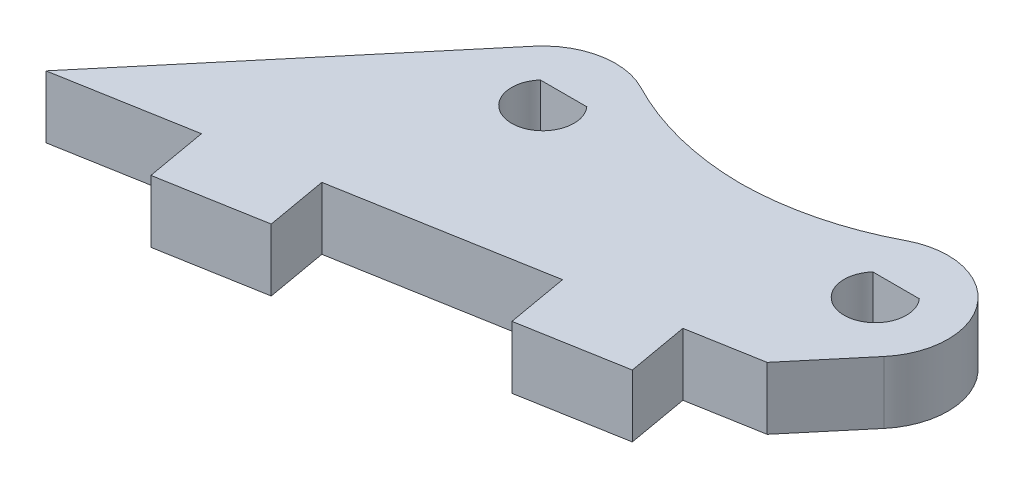
ISO-10303-21;
HEADER;
FILE_DESCRIPTION(('STEP AP214'),'2;1');
FILE_NAME('part.step','',(''),(''),'','','');
FILE_SCHEMA(('AUTOMOTIVE_DESIGN { 1 0 10303 214 1 1 1 1 }'));
ENDSEC;
DATA;
#1=APPLICATION_CONTEXT('core data for automotive mechanical design processes');
#2=APPLICATION_PROTOCOL_DEFINITION('international standard','automotive_design',2000,#1);
#3=PRODUCT_CONTEXT('',#1,'mechanical');
#4=PRODUCT('Part','Part','',(#3));
#5=PRODUCT_RELATED_PRODUCT_CATEGORY('part','',(#4));
#6=PRODUCT_DEFINITION_FORMATION('','',#4);
#7=PRODUCT_DEFINITION_CONTEXT('part definition',#1,'design');
#8=PRODUCT_DEFINITION('design','',#6,#7);
#9=PRODUCT_DEFINITION_SHAPE('','',#8);
#10=(LENGTH_UNIT() NAMED_UNIT(*) SI_UNIT(.MILLI.,.METRE.));
#11=(NAMED_UNIT(*) PLANE_ANGLE_UNIT() SI_UNIT($,.RADIAN.));
#12=(NAMED_UNIT(*) SI_UNIT($,.STERADIAN.) SOLID_ANGLE_UNIT());
#13=UNCERTAINTY_MEASURE_WITH_UNIT(LENGTH_MEASURE(1.E-05),#10,'distance_accuracy_value','');
#14=(GEOMETRIC_REPRESENTATION_CONTEXT(3) GLOBAL_UNCERTAINTY_ASSIGNED_CONTEXT((#13)) GLOBAL_UNIT_ASSIGNED_CONTEXT((#10,
#11,#12)) REPRESENTATION_CONTEXT('',''));
#15=CARTESIAN_POINT('',(0.,0.,0.));
#16=DIRECTION('',(0.,0.,1.));
#17=DIRECTION('',(1.,0.,0.));
#18=AXIS2_PLACEMENT_3D('',#15,#16,#17);
#19=CARTESIAN_POINT('',(0.912053363653995,3.,5.17251165981218));
#20=DIRECTION('',(0.173648177666927,0.,0.984807753012208));
#21=DIRECTION('',(0.984807753012209,0.,-0.173648177666927));
#22=AXIS2_PLACEMENT_3D('',#19,#20,#21);
#23=PLANE('',#22);
#24=DIRECTION('',(-0.984807753012209,0.,0.173648177666927));
#25=VECTOR('',#24,1.);
#26=CARTESIAN_POINT('',(0.912053363653995,0.,5.17251165981218));
#27=LINE('',#26,#25);
#28=CARTESIAN_POINT('',(-8.26086078843347,0.,6.78994391654768));
#29=VERTEX_POINT('',#28);
#30=CARTESIAN_POINT('',(-18.1089383185556,0.,8.52642569321695));
#31=VERTEX_POINT('',#30);
#32=EDGE_CURVE('E210',#29,#31,#27,.T.);
#33=ORIENTED_EDGE('',*,*,#32,.F.);
#34=DIRECTION('',(0.,-1.,0.));
#35=VECTOR('',#34,1.);
#36=CARTESIAN_POINT('',(-8.26086078843347,0.,6.78994391654768));
#37=LINE('',#36,#35);
#38=CARTESIAN_POINT('',(-8.26086078843347,3.,6.78994391654768));
#39=VERTEX_POINT('',#38);
#40=EDGE_CURVE('E291',#39,#29,#37,.T.);
#41=ORIENTED_EDGE('',*,*,#40,.F.);
#42=DIRECTION('',(-0.984807753012209,0.,0.173648177666927));
#43=VECTOR('',#42,1.);
#44=CARTESIAN_POINT('',(0.912053363653995,3.,5.17251165981218));
#45=LINE('',#44,#43);
#46=CARTESIAN_POINT('',(-18.1089383185556,3.,8.52642569321695));
#47=VERTEX_POINT('',#46);
#48=EDGE_CURVE('E261',#39,#47,#45,.T.);
#49=ORIENTED_EDGE('',*,*,#48,.T.);
#50=DIRECTION('',(0.,1.,0.));
#51=VECTOR('',#50,1.);
#52=CARTESIAN_POINT('',(-18.1089383185556,0.,8.52642569321696));
#53=LINE('',#52,#51);
#54=EDGE_CURVE('E288',#31,#47,#53,.T.);
#55=ORIENTED_EDGE('',*,*,#54,.F.);
#56=EDGE_LOOP('',(#33,#41,#49,#55));
#57=FACE_BOUND('',#56,.T.);
#58=ADVANCED_FACE('F41',(#57),#23,.T.);
#59=CARTESIAN_POINT('',(0.110005112170298,3.,5.3139344063788));
#60=VERTEX_POINT('',#59);
#61=CARTESIAN_POINT('',(-3.33682202337243,3.,5.92170302821305));
#62=VERTEX_POINT('',#61);
#63=EDGE_CURVE('E259',#60,#62,#45,.T.);
#64=ORIENTED_EDGE('',*,*,#63,.T.);
#65=DIRECTION('',(0.,1.,0.));
#66=VECTOR('',#65,1.);
#67=CARTESIAN_POINT('',(-3.33682202337243,0.,5.92170302821305));
#68=LINE('',#67,#66);
#69=CARTESIAN_POINT('',(-3.33682202337243,0.,5.92170302821305));
#70=VERTEX_POINT('',#69);
#71=EDGE_CURVE('E302',#70,#62,#68,.T.);
#72=ORIENTED_EDGE('',*,*,#71,.F.);
#73=CARTESIAN_POINT('',(0.110005112170298,0.,5.3139344063788));
#74=VERTEX_POINT('',#73);
#75=EDGE_CURVE('E206',#74,#70,#27,.T.);
#76=ORIENTED_EDGE('',*,*,#75,.F.);
#77=DIRECTION('',(0.,-1.,0.));
#78=VECTOR('',#77,1.);
#79=CARTESIAN_POINT('',(0.110005112170298,3.,5.3139344063788));
#80=LINE('',#79,#78);
#81=EDGE_CURVE('E191',#60,#74,#80,.T.);
#82=ORIENTED_EDGE('',*,*,#81,.F.);
#83=EDGE_LOOP('',(#64,#72,#76,#82));
#84=FACE_BOUND('',#83,.T.);
#85=ADVANCED_FACE('F340',(#84),#23,.T.);
#86=CARTESIAN_POINT('',(-16.,3.,0.));
#87=DIRECTION('',(0.,-1.,0.));
#88=DIRECTION('',(0.,0.,-1.));
#89=AXIS2_PLACEMENT_3D('',#86,#87,#88);
#90=CYLINDRICAL_SURFACE('',#89,3.5);
#91=CARTESIAN_POINT('',(-16.,3.,0.));
#92=DIRECTION('',(0.,1.,0.));
#93=DIRECTION('',(0.,0.,1.));
#94=AXIS2_PLACEMENT_3D('',#91,#92,#93);
#95=CIRCLE('',#94,3.5);
#96=CARTESIAN_POINT('',(-14.3751923190728,3.,-3.1));
#97=VERTEX_POINT('',#96);
#98=CARTESIAN_POINT('',(-18.6811555509164,3.,-2.24975663390287));
#99=VERTEX_POINT('',#98);
#100=EDGE_CURVE('E268',#97,#99,#95,.T.);
#101=ORIENTED_EDGE('',*,*,#100,.F.);
#102=DIRECTION('',(0.,-1.,0.));
#103=VECTOR('',#102,1.);
#104=CARTESIAN_POINT('',(-14.3751923190728,3.,-3.1));
#105=LINE('',#104,#103);
#106=CARTESIAN_POINT('',(-14.3751923190728,0.,-3.1));
#107=VERTEX_POINT('',#106);
#108=EDGE_CURVE('E228',#97,#107,#105,.T.);
#109=ORIENTED_EDGE('',*,*,#108,.T.);
#110=CARTESIAN_POINT('',(-16.,0.,0.));
#111=DIRECTION('',(0.,1.,0.));
#112=DIRECTION('',(0.,0.,1.));
#113=AXIS2_PLACEMENT_3D('',#110,#111,#112);
#114=CIRCLE('',#113,3.5);
#115=CARTESIAN_POINT('',(-18.6811555509164,0.,-2.24975663390287));
#116=VERTEX_POINT('',#115);
#117=EDGE_CURVE('E200',#107,#116,#114,.T.);
#118=ORIENTED_EDGE('',*,*,#117,.T.);
#119=DIRECTION('',(0.,-1.,0.));
#120=VECTOR('',#119,1.);
#121=CARTESIAN_POINT('',(-18.6811555509164,3.,-2.24975663390287));
#122=LINE('',#121,#120);
#123=EDGE_CURVE('E222',#99,#116,#122,.T.);
#124=ORIENTED_EDGE('',*,*,#123,.F.);
#125=EDGE_LOOP('',(#101,#109,#118,#124));
#126=FACE_BOUND('',#125,.T.);
#127=ADVANCED_FACE('F347',(#126),#90,.T.);
#128=CARTESIAN_POINT('',(-12.070340972252,3.,-10.1282186580005));
#129=DIRECTION('',(0.766044443118982,0.,0.642787609686535));
#130=DIRECTION('',(0.642787609686535,0.,-0.766044443118982));
#131=AXIS2_PLACEMENT_3D('',#128,#129,#130);
#132=PLANE('',#131);
#133=DIRECTION('',(-0.642787609686535,0.,0.766044443118982));
#134=VECTOR('',#133,1.);
#135=CARTESIAN_POINT('',(-12.070340972252,0.,-10.1282186580005));
#136=LINE('',#135,#134);
#137=CARTESIAN_POINT('',(-29.3929879341661,0.,10.516108092102));
#138=VERTEX_POINT('',#137);
#139=EDGE_CURVE('E202',#116,#138,#136,.T.);
#140=ORIENTED_EDGE('',*,*,#139,.T.);
#141=DIRECTION('',(0.,-1.,0.));
#142=VECTOR('',#141,1.);
#143=CARTESIAN_POINT('',(-29.3929879341661,3.,10.516108092102));
#144=LINE('',#143,#142);
#145=CARTESIAN_POINT('',(-29.3929879341661,3.,10.516108092102));
#146=VERTEX_POINT('',#145);
#147=EDGE_CURVE('E219',#146,#138,#144,.T.);
#148=ORIENTED_EDGE('',*,*,#147,.F.);
#149=DIRECTION('',(-0.642787609686535,0.,0.766044443118982));
#150=VECTOR('',#149,1.);
#151=CARTESIAN_POINT('',(-12.070340972252,3.,-10.1282186580005));
#152=LINE('',#151,#150);
#153=EDGE_CURVE('E265',#99,#146,#152,.T.);
#154=ORIENTED_EDGE('',*,*,#153,.F.);
#155=ORIENTED_EDGE('',*,*,#123,.T.);
#156=EDGE_LOOP('',(#140,#148,#154,#155));
#157=FACE_BOUND('',#156,.T.);
#158=ADVANCED_FACE('F354',(#157),#132,.F.);
#159=DIRECTION('',(0.,-1.,0.));
#160=VECTOR('',#159,1.);
#161=CARTESIAN_POINT('',(-23.0329770836166,0.,9.39466658155159));
#162=LINE('',#161,#160);
#163=CARTESIAN_POINT('',(-23.0329770836166,3.,9.39466658155159));
#164=VERTEX_POINT('',#163);
#165=CARTESIAN_POINT('',(-23.0329770836166,0.,9.39466658155159));
#166=VERTEX_POINT('',#165);
#167=EDGE_CURVE('E284',#164,#166,#162,.T.);
#168=ORIENTED_EDGE('',*,*,#167,.F.);
#169=EDGE_CURVE('E263',#164,#146,#45,.T.);
#170=ORIENTED_EDGE('',*,*,#169,.T.);
#171=ORIENTED_EDGE('',*,*,#147,.T.);
#172=EDGE_CURVE('E205',#166,#138,#27,.T.);
#173=ORIENTED_EDGE('',*,*,#172,.F.);
#174=EDGE_LOOP('',(#168,#170,#171,#173));
#175=FACE_BOUND('',#174,.T.);
#176=ADVANCED_FACE('F343',(#175),#23,.T.);
#177=CARTESIAN_POINT('',(2.68115555091644,3.,2.24975663390287));
#178=DIRECTION('',(0.766044443118982,0.,0.642787609686535));
#179=DIRECTION('',(0.642787609686535,0.,-0.766044443118982));
#180=AXIS2_PLACEMENT_3D('',#177,#178,#179);
#181=PLANE('',#180);
#182=DIRECTION('',(-0.642787609686535,0.,0.766044443118982));
#183=VECTOR('',#182,1.);
#184=CARTESIAN_POINT('',(2.68115555091644,0.,2.24975663390287));
#185=LINE('',#184,#183);
#186=CARTESIAN_POINT('',(2.68115555091644,0.,2.24975663390287));
#187=VERTEX_POINT('',#186);
#188=EDGE_CURVE('E209',#187,#74,#185,.T.);
#189=ORIENTED_EDGE('',*,*,#188,.F.);
#190=DIRECTION('',(0.,-1.,0.));
#191=VECTOR('',#190,1.);
#192=CARTESIAN_POINT('',(2.68115555091644,3.,2.24975663390287));
#193=LINE('',#192,#191);
#194=CARTESIAN_POINT('',(2.68115555091644,3.,2.24975663390287));
#195=VERTEX_POINT('',#194);
#196=EDGE_CURVE('E188',#195,#187,#193,.T.);
#197=ORIENTED_EDGE('',*,*,#196,.F.);
#198=DIRECTION('',(-0.642787609686535,0.,0.766044443118982));
#199=VECTOR('',#198,1.);
#200=CARTESIAN_POINT('',(2.68115555091644,3.,2.24975663390287));
#201=LINE('',#200,#199);
#202=EDGE_CURVE('E194',#195,#60,#201,.T.);
#203=ORIENTED_EDGE('',*,*,#202,.T.);
#204=ORIENTED_EDGE('',*,*,#81,.T.);
#205=EDGE_LOOP('',(#189,#197,#203,#204));
#206=FACE_BOUND('',#205,.T.);
#207=ADVANCED_FACE('F353',(#206),#181,.T.);
#208=CARTESIAN_POINT('',(0.,3.,0.));
#209=DIRECTION('',(0.,-1.,0.));
#210=DIRECTION('',(0.,0.,-1.));
#211=AXIS2_PLACEMENT_3D('',#208,#209,#210);
#212=CYLINDRICAL_SURFACE('',#211,3.5);
#213=CARTESIAN_POINT('',(0.,0.,0.));
#214=DIRECTION('',(0.,1.,0.));
#215=DIRECTION('',(0.,0.,1.));
#216=AXIS2_PLACEMENT_3D('',#213,#214,#215);
#217=CIRCLE('',#216,3.5);
#218=CARTESIAN_POINT('',(-1.62480768092719,0.,-3.1));
#219=VERTEX_POINT('',#218);
#220=EDGE_CURVE('E213',#187,#219,#217,.T.);
#221=ORIENTED_EDGE('',*,*,#220,.T.);
#222=DIRECTION('',(0.,-1.,0.));
#223=VECTOR('',#222,1.);
#224=CARTESIAN_POINT('',(-1.62480768092719,3.,-3.1));
#225=LINE('',#224,#223);
#226=CARTESIAN_POINT('',(-1.62480768092719,3.,-3.1));
#227=VERTEX_POINT('',#226);
#228=EDGE_CURVE('E225',#219,#227,#225,.F.);
#229=ORIENTED_EDGE('',*,*,#228,.T.);
#230=CARTESIAN_POINT('',(0.,3.,0.));
#231=DIRECTION('',(0.,1.,0.));
#232=DIRECTION('',(0.,0.,1.));
#233=AXIS2_PLACEMENT_3D('',#230,#231,#232);
#234=CIRCLE('',#233,3.5);
#235=EDGE_CURVE('E189',#195,#227,#234,.T.);
#236=ORIENTED_EDGE('',*,*,#235,.F.);
#237=ORIENTED_EDGE('',*,*,#196,.T.);
#238=EDGE_LOOP('',(#221,#229,#236,#237));
#239=FACE_BOUND('',#238,.T.);
#240=ADVANCED_FACE('F252',(#239),#212,.T.);
#241=CARTESIAN_POINT('',(-16.,3.,0.));
#242=DIRECTION('',(0.,-1.,0.));
#243=DIRECTION('',(0.,0.,-1.));
#244=AXIS2_PLACEMENT_3D('',#241,#242,#243);
#245=CYLINDRICAL_SURFACE('',#244,1.5);
#246=DIRECTION('',(0.,-1.,0.));
#247=VECTOR('',#246,1.);
#248=CARTESIAN_POINT('',(-17.1180339887499,5.29128784747792,-1.));
#249=LINE('',#248,#247);
#250=CARTESIAN_POINT('',(-17.1180339887499,3.,-1.));
#251=VERTEX_POINT('',#250);
#252=CARTESIAN_POINT('',(-17.1180339887499,0.,-1.));
#253=VERTEX_POINT('',#252);
#254=EDGE_CURVE('E323',#251,#253,#249,.T.);
#255=ORIENTED_EDGE('',*,*,#254,.F.);
#256=CARTESIAN_POINT('',(-16.,3.,0.));
#257=DIRECTION('',(0.,1.,0.));
#258=DIRECTION('',(0.,0.,1.));
#259=AXIS2_PLACEMENT_3D('',#256,#257,#258);
#260=CIRCLE('',#259,1.5);
#261=CARTESIAN_POINT('',(-14.8819660112501,3.,-1.));
#262=VERTEX_POINT('',#261);
#263=EDGE_CURVE('E216',#251,#262,#260,.T.);
#264=ORIENTED_EDGE('',*,*,#263,.T.);
#265=DIRECTION('',(0.,-1.,0.));
#266=VECTOR('',#265,1.);
#267=CARTESIAN_POINT('',(-14.8819660112501,5.29128784747792,-1.));
#268=LINE('',#267,#266);
#269=CARTESIAN_POINT('',(-14.8819660112501,0.,-1.));
#270=VERTEX_POINT('',#269);
#271=EDGE_CURVE('E320',#262,#270,#268,.T.);
#272=ORIENTED_EDGE('',*,*,#271,.T.);
#273=CARTESIAN_POINT('',(-16.,0.,0.));
#274=DIRECTION('',(0.,1.,0.));
#275=DIRECTION('',(0.,0.,1.));
#276=AXIS2_PLACEMENT_3D('',#273,#274,#275);
#277=CIRCLE('',#276,1.5);
#278=EDGE_CURVE('E198',#253,#270,#277,.T.);
#279=ORIENTED_EDGE('',*,*,#278,.F.);
#280=EDGE_LOOP('',(#255,#264,#272,#279));
#281=FACE_BOUND('',#280,.T.);
#282=ADVANCED_FACE('F418',(#281),#245,.F.);
#283=CARTESIAN_POINT('',(0.,3.,0.));
#284=DIRECTION('',(0.,-1.,0.));
#285=DIRECTION('',(0.,0.,-1.));
#286=AXIS2_PLACEMENT_3D('',#283,#284,#285);
#287=CYLINDRICAL_SURFACE('',#286,1.5);
#288=DIRECTION('',(0.,-1.,0.));
#289=VECTOR('',#288,1.);
#290=CARTESIAN_POINT('',(-1.11803398874989,5.29128784747792,-1.));
#291=LINE('',#290,#289);
#292=CARTESIAN_POINT('',(-1.11803398874989,3.,-1.));
#293=VERTEX_POINT('',#292);
#294=CARTESIAN_POINT('',(-1.11803398874989,0.,-1.));
#295=VERTEX_POINT('',#294);
#296=EDGE_CURVE('E174',#293,#295,#291,.T.);
#297=ORIENTED_EDGE('',*,*,#296,.F.);
#298=CARTESIAN_POINT('',(0.,3.,0.));
#299=DIRECTION('',(0.,1.,0.));
#300=DIRECTION('',(0.,0.,1.));
#301=AXIS2_PLACEMENT_3D('',#298,#299,#300);
#302=CIRCLE('',#301,1.5);
#303=CARTESIAN_POINT('',(1.11803398874989,3.,-1.));
#304=VERTEX_POINT('',#303);
#305=EDGE_CURVE('E184',#293,#304,#302,.T.);
#306=ORIENTED_EDGE('',*,*,#305,.T.);
#307=DIRECTION('',(0.,-1.,0.));
#308=VECTOR('',#307,1.);
#309=CARTESIAN_POINT('',(1.11803398874989,5.29128784747792,-1.));
#310=LINE('',#309,#308);
#311=CARTESIAN_POINT('',(1.11803398874989,0.,-1.));
#312=VERTEX_POINT('',#311);
#313=EDGE_CURVE('E177',#304,#312,#310,.T.);
#314=ORIENTED_EDGE('',*,*,#313,.T.);
#315=CARTESIAN_POINT('',(0.,0.,0.));
#316=DIRECTION('',(0.,1.,0.));
#317=DIRECTION('',(0.,0.,1.));
#318=AXIS2_PLACEMENT_3D('',#315,#316,#317);
#319=CIRCLE('',#318,1.5);
#320=EDGE_CURVE('E185',#295,#312,#319,.T.);
#321=ORIENTED_EDGE('',*,*,#320,.F.);
#322=EDGE_LOOP('',(#297,#306,#314,#321));
#323=FACE_BOUND('',#322,.T.);
#324=ADVANCED_FACE('F183',(#323),#287,.F.);
#325=CARTESIAN_POINT('',(0.,3.,0.));
#326=DIRECTION('',(0.,1.,0.));
#327=DIRECTION('',(0.,0.,1.));
#328=AXIS2_PLACEMENT_3D('',#325,#326,#327);
#329=PLANE('',#328);
#330=ORIENTED_EDGE('',*,*,#263,.F.);
#331=DIRECTION('',(-1.,0.,0.));
#332=VECTOR('',#331,1.);
#333=CARTESIAN_POINT('',(0.,3.,-0.999999999999997));
#334=LINE('',#333,#332);
#335=EDGE_CURVE('E325',#262,#251,#334,.T.);
#336=ORIENTED_EDGE('',*,*,#335,.F.);
#337=EDGE_LOOP('',(#330,#336));
#338=FACE_BOUND('',#337,.T.);
#339=CARTESIAN_POINT('',(-8.12403840463596,3.,-15.5));
#340=DIRECTION('',(0.,1.,0.));
#341=DIRECTION('',(0.,0.,1.));
#342=AXIS2_PLACEMENT_3D('',#339,#340,#341);
#343=CIRCLE('',#342,14.);
#344=CARTESIAN_POINT('',(-8.,3.,-1.50054949384886));
#345=VERTEX_POINT('',#344);
#346=EDGE_CURVE('E232',#227,#345,#343,.F.);
#347=ORIENTED_EDGE('',*,*,#346,.T.);
#348=CARTESIAN_POINT('',(-7.87596159536404,3.,-15.5));
#349=DIRECTION('',(0.,1.,0.));
#350=DIRECTION('',(0.,0.,1.));
#351=AXIS2_PLACEMENT_3D('',#348,#349,#350);
#352=CIRCLE('',#351,14.);
#353=EDGE_CURVE('E11',#345,#97,#352,.F.);
#354=ORIENTED_EDGE('',*,*,#353,.T.);
#355=ORIENTED_EDGE('',*,*,#100,.T.);
#356=ORIENTED_EDGE('',*,*,#153,.T.);
#357=ORIENTED_EDGE('',*,*,#169,.F.);
#358=DIRECTION('',(-0.173648177666927,0.,-0.984807753012208));
#359=VECTOR('',#358,1.);
#360=CARTESIAN_POINT('',(-22.5120325506158,3.,12.3490898405882));
#361=LINE('',#360,#359);
#362=CARTESIAN_POINT('',(-22.5120325506158,3.,12.3490898405882));
#363=VERTEX_POINT('',#362);
#364=EDGE_CURVE('E274',#363,#164,#361,.T.);
#365=ORIENTED_EDGE('',*,*,#364,.F.);
#366=DIRECTION('',(-0.984807753012208,0.,0.173648177666927));
#367=VECTOR('',#366,1.);
#368=CARTESIAN_POINT('',(-22.5120325506158,3.,12.3490898405882));
#369=LINE('',#368,#367);
#370=CARTESIAN_POINT('',(-17.5879937855548,3.,11.4808489522536));
#371=VERTEX_POINT('',#370);
#372=EDGE_CURVE('E295',#371,#363,#369,.T.);
#373=ORIENTED_EDGE('',*,*,#372,.F.);
#374=DIRECTION('',(-0.173648177666927,0.,-0.984807753012208));
#375=VECTOR('',#374,1.);
#376=CARTESIAN_POINT('',(-17.5879937855548,3.,11.4808489522536));
#377=LINE('',#376,#375);
#378=EDGE_CURVE('E247',#371,#47,#377,.T.);
#379=ORIENTED_EDGE('',*,*,#378,.T.);
#380=ORIENTED_EDGE('',*,*,#48,.F.);
#381=DIRECTION('',(-0.173648177666927,0.,-0.984807753012208));
#382=VECTOR('',#381,1.);
#383=CARTESIAN_POINT('',(-7.73991625543269,3.,9.74436717558431));
#384=LINE('',#383,#382);
#385=CARTESIAN_POINT('',(-7.73991625543269,3.,9.74436717558431));
#386=VERTEX_POINT('',#385);
#387=EDGE_CURVE('E309',#386,#39,#384,.T.);
#388=ORIENTED_EDGE('',*,*,#387,.F.);
#389=DIRECTION('',(-0.984807753012209,0.,0.173648177666927));
#390=VECTOR('',#389,1.);
#391=CARTESIAN_POINT('',(-2.81587749037165,3.,8.87612628724967));
#392=LINE('',#391,#390);
#393=CARTESIAN_POINT('',(-2.81587749037165,3.,8.87612628724967));
#394=VERTEX_POINT('',#393);
#395=EDGE_CURVE('E307',#394,#386,#392,.T.);
#396=ORIENTED_EDGE('',*,*,#395,.F.);
#397=DIRECTION('',(-0.173648177666927,0.,-0.984807753012208));
#398=VECTOR('',#397,1.);
#399=CARTESIAN_POINT('',(-2.81587749037165,3.,8.87612628724967));
#400=LINE('',#399,#398);
#401=EDGE_CURVE('E313',#394,#62,#400,.T.);
#402=ORIENTED_EDGE('',*,*,#401,.T.);
#403=ORIENTED_EDGE('',*,*,#63,.F.);
#404=ORIENTED_EDGE('',*,*,#202,.F.);
#405=ORIENTED_EDGE('',*,*,#235,.T.);
#406=EDGE_LOOP('',(#347,#354,#355,#356,#357,#365,#373,#379,#380,#388,#396,#402,#403,#404,#405));
#407=FACE_BOUND('',#406,.T.);
#408=ORIENTED_EDGE('',*,*,#305,.F.);
#409=DIRECTION('',(-1.,0.,0.));
#410=VECTOR('',#409,1.);
#411=CARTESIAN_POINT('',(0.,3.,-1.));
#412=LINE('',#411,#410);
#413=EDGE_CURVE('E171',#304,#293,#412,.T.);
#414=ORIENTED_EDGE('',*,*,#413,.F.);
#415=EDGE_LOOP('',(#408,#414));
#416=FACE_BOUND('',#415,.T.);
#417=ADVANCED_FACE('F187',(#338,#407,#416),#329,.T.);
#418=CARTESIAN_POINT('',(0.,0.,0.));
#419=DIRECTION('',(0.,1.,0.));
#420=DIRECTION('',(0.,0.,1.));
#421=AXIS2_PLACEMENT_3D('',#418,#419,#420);
#422=PLANE('',#421);
#423=ORIENTED_EDGE('',*,*,#278,.T.);
#424=DIRECTION('',(-1.,0.,0.));
#425=VECTOR('',#424,1.);
#426=CARTESIAN_POINT('',(0.,0.,-0.999999999999997));
#427=LINE('',#426,#425);
#428=EDGE_CURVE('E63',#270,#253,#427,.T.);
#429=ORIENTED_EDGE('',*,*,#428,.T.);
#430=EDGE_LOOP('',(#423,#429));
#431=FACE_BOUND('',#430,.T.);
#432=ORIENTED_EDGE('',*,*,#117,.F.);
#433=CARTESIAN_POINT('',(-7.87596159536404,0.,-15.5));
#434=DIRECTION('',(0.,1.,0.));
#435=DIRECTION('',(0.,0.,1.));
#436=AXIS2_PLACEMENT_3D('',#433,#434,#435);
#437=CIRCLE('',#436,14.);
#438=CARTESIAN_POINT('',(-8.,0.,-1.50054949384886));
#439=VERTEX_POINT('',#438);
#440=EDGE_CURVE('E50',#107,#439,#437,.T.);
#441=ORIENTED_EDGE('',*,*,#440,.T.);
#442=CARTESIAN_POINT('',(-8.12403840463596,0.,-15.5));
#443=DIRECTION('',(0.,1.,0.));
#444=DIRECTION('',(0.,0.,1.));
#445=AXIS2_PLACEMENT_3D('',#442,#443,#444);
#446=CIRCLE('',#445,14.);
#447=EDGE_CURVE('E230',#439,#219,#446,.T.);
#448=ORIENTED_EDGE('',*,*,#447,.T.);
#449=ORIENTED_EDGE('',*,*,#220,.F.);
#450=ORIENTED_EDGE('',*,*,#188,.T.);
#451=ORIENTED_EDGE('',*,*,#75,.T.);
#452=DIRECTION('',(-0.173648177666927,0.,-0.984807753012208));
#453=VECTOR('',#452,1.);
#454=CARTESIAN_POINT('',(-2.81587749037165,0.,8.87612628724967));
#455=LINE('',#454,#453);
#456=CARTESIAN_POINT('',(-2.81587749037165,0.,8.87612628724967));
#457=VERTEX_POINT('',#456);
#458=EDGE_CURVE('E315',#457,#70,#455,.T.);
#459=ORIENTED_EDGE('',*,*,#458,.F.);
#460=DIRECTION('',(0.984807753012209,0.,-0.173648177666927));
#461=VECTOR('',#460,1.);
#462=CARTESIAN_POINT('',(-2.81587749037165,0.,8.87612628724967));
#463=LINE('',#462,#461);
#464=CARTESIAN_POINT('',(-7.73991625543269,0.,9.74436717558431));
#465=VERTEX_POINT('',#464);
#466=EDGE_CURVE('E303',#465,#457,#463,.T.);
#467=ORIENTED_EDGE('',*,*,#466,.F.);
#468=DIRECTION('',(-0.173648177666927,0.,-0.984807753012208));
#469=VECTOR('',#468,1.);
#470=CARTESIAN_POINT('',(-7.73991625543269,0.,9.74436717558431));
#471=LINE('',#470,#469);
#472=EDGE_CURVE('E317',#465,#29,#471,.T.);
#473=ORIENTED_EDGE('',*,*,#472,.T.);
#474=ORIENTED_EDGE('',*,*,#32,.T.);
#475=DIRECTION('',(-0.173648177666927,0.,-0.984807753012208));
#476=VECTOR('',#475,1.);
#477=CARTESIAN_POINT('',(-17.5879937855548,0.,11.4808489522536));
#478=LINE('',#477,#476);
#479=CARTESIAN_POINT('',(-17.5879937855548,0.,11.4808489522536));
#480=VERTEX_POINT('',#479);
#481=EDGE_CURVE('E280',#480,#31,#478,.T.);
#482=ORIENTED_EDGE('',*,*,#481,.F.);
#483=DIRECTION('',(0.984807753012208,0.,-0.173648177666927));
#484=VECTOR('',#483,1.);
#485=CARTESIAN_POINT('',(-22.5120325506158,0.,12.3490898405882));
#486=LINE('',#485,#484);
#487=CARTESIAN_POINT('',(-22.5120325506158,0.,12.3490898405882));
#488=VERTEX_POINT('',#487);
#489=EDGE_CURVE('E283',#488,#480,#486,.T.);
#490=ORIENTED_EDGE('',*,*,#489,.F.);
#491=DIRECTION('',(-0.173648177666927,0.,-0.984807753012208));
#492=VECTOR('',#491,1.);
#493=CARTESIAN_POINT('',(-22.5120325506158,0.,12.3490898405882));
#494=LINE('',#493,#492);
#495=EDGE_CURVE('E277',#488,#166,#494,.T.);
#496=ORIENTED_EDGE('',*,*,#495,.T.);
#497=ORIENTED_EDGE('',*,*,#172,.T.);
#498=ORIENTED_EDGE('',*,*,#139,.F.);
#499=EDGE_LOOP('',(#432,#441,#448,#449,#450,#451,#459,#467,#473,#474,#482,#490,#496,#497,#498));
#500=FACE_BOUND('',#499,.T.);
#501=ORIENTED_EDGE('',*,*,#320,.T.);
#502=DIRECTION('',(-1.,0.,0.));
#503=VECTOR('',#502,1.);
#504=CARTESIAN_POINT('',(0.,0.,-1.));
#505=LINE('',#504,#503);
#506=EDGE_CURVE('E56',#312,#295,#505,.T.);
#507=ORIENTED_EDGE('',*,*,#506,.T.);
#508=EDGE_LOOP('',(#501,#507));
#509=FACE_BOUND('',#508,.T.);
#510=ADVANCED_FACE('F238',(#431,#500,#509),#422,.F.);
#511=CARTESIAN_POINT('',(-7.87596159536404,3.,-15.5));
#512=DIRECTION('',(0.,-1.,0.));
#513=DIRECTION('',(0.,0.,-1.));
#514=AXIS2_PLACEMENT_3D('',#511,#512,#513);
#515=CYLINDRICAL_SURFACE('',#514,14.);
#516=ORIENTED_EDGE('',*,*,#108,.F.);
#517=ORIENTED_EDGE('',*,*,#353,.F.);
#518=DIRECTION('',(0.,-1.,0.));
#519=VECTOR('',#518,1.);
#520=CARTESIAN_POINT('',(-8.,1.5,-1.50054949384886));
#521=LINE('',#520,#519);
#522=EDGE_CURVE('E45',#439,#345,#521,.F.);
#523=ORIENTED_EDGE('',*,*,#522,.F.);
#524=ORIENTED_EDGE('',*,*,#440,.F.);
#525=EDGE_LOOP('',(#516,#517,#523,#524));
#526=FACE_BOUND('',#525,.T.);
#527=ADVANCED_FACE('F43',(#526),#515,.F.);
#528=CARTESIAN_POINT('',(-8.12403840463596,3.,-15.5));
#529=DIRECTION('',(0.,-1.,0.));
#530=DIRECTION('',(0.,0.,-1.));
#531=AXIS2_PLACEMENT_3D('',#528,#529,#530);
#532=CYLINDRICAL_SURFACE('',#531,14.);
#533=ORIENTED_EDGE('',*,*,#346,.F.);
#534=ORIENTED_EDGE('',*,*,#228,.F.);
#535=ORIENTED_EDGE('',*,*,#447,.F.);
#536=ORIENTED_EDGE('',*,*,#522,.T.);
#537=EDGE_LOOP('',(#533,#534,#535,#536));
#538=FACE_BOUND('',#537,.T.);
#539=ADVANCED_FACE('F249',(#538),#532,.F.);
#540=CARTESIAN_POINT('',(-17.5879937855548,0.,11.4808489522536));
#541=DIRECTION('',(-0.984807753012208,0.,0.173648177666927));
#542=DIRECTION('',(0.173648177666927,0.,0.984807753012209));
#543=AXIS2_PLACEMENT_3D('',#540,#541,#542);
#544=PLANE('',#543);
#545=ORIENTED_EDGE('',*,*,#54,.T.);
#546=ORIENTED_EDGE('',*,*,#378,.F.);
#547=DIRECTION('',(0.,1.,0.));
#548=VECTOR('',#547,1.);
#549=CARTESIAN_POINT('',(-17.5879937855548,0.,11.4808489522536));
#550=LINE('',#549,#548);
#551=EDGE_CURVE('E287',#480,#371,#550,.T.);
#552=ORIENTED_EDGE('',*,*,#551,.F.);
#553=ORIENTED_EDGE('',*,*,#481,.T.);
#554=EDGE_LOOP('',(#545,#546,#552,#553));
#555=FACE_BOUND('',#554,.T.);
#556=ADVANCED_FACE('F379',(#555),#544,.F.);
#557=CARTESIAN_POINT('',(-22.5120325506158,0.,12.3490898405882));
#558=DIRECTION('',(0.984807753012208,0.,-0.173648177666927));
#559=DIRECTION('',(-0.173648177666927,0.,-0.984807753012209));
#560=AXIS2_PLACEMENT_3D('',#557,#558,#559);
#561=PLANE('',#560);
#562=ORIENTED_EDGE('',*,*,#167,.T.);
#563=ORIENTED_EDGE('',*,*,#495,.F.);
#564=DIRECTION('',(0.,-1.,0.));
#565=VECTOR('',#564,1.);
#566=CARTESIAN_POINT('',(-22.5120325506158,0.,12.3490898405882));
#567=LINE('',#566,#565);
#568=EDGE_CURVE('E293',#363,#488,#567,.T.);
#569=ORIENTED_EDGE('',*,*,#568,.F.);
#570=ORIENTED_EDGE('',*,*,#364,.T.);
#571=EDGE_LOOP('',(#562,#563,#569,#570));
#572=FACE_BOUND('',#571,.T.);
#573=ADVANCED_FACE('F368',(#572),#561,.F.);
#574=CARTESIAN_POINT('',(1.43299789665478,0.,8.12693491884881));
#575=DIRECTION('',(-0.173648177666927,0.,-0.984807753012209));
#576=DIRECTION('',(-0.984807753012209,0.,0.173648177666927));
#577=AXIS2_PLACEMENT_3D('',#574,#575,#576);
#578=PLANE('',#577);
#579=ORIENTED_EDGE('',*,*,#551,.T.);
#580=ORIENTED_EDGE('',*,*,#372,.T.);
#581=ORIENTED_EDGE('',*,*,#568,.T.);
#582=ORIENTED_EDGE('',*,*,#489,.T.);
#583=EDGE_LOOP('',(#579,#580,#581,#582));
#584=FACE_BOUND('',#583,.T.);
#585=ADVANCED_FACE('F371',(#584),#578,.F.);
#586=CARTESIAN_POINT('',(-7.73991625543269,0.,9.74436717558431));
#587=DIRECTION('',(0.984807753012208,0.,-0.173648177666927));
#588=DIRECTION('',(-0.173648177666927,0.,-0.984807753012209));
#589=AXIS2_PLACEMENT_3D('',#586,#587,#588);
#590=PLANE('',#589);
#591=ORIENTED_EDGE('',*,*,#40,.T.);
#592=ORIENTED_EDGE('',*,*,#472,.F.);
#593=DIRECTION('',(0.,-1.,0.));
#594=VECTOR('',#593,1.);
#595=CARTESIAN_POINT('',(-7.73991625543269,0.,9.74436717558431));
#596=LINE('',#595,#594);
#597=EDGE_CURVE('E299',#386,#465,#596,.T.);
#598=ORIENTED_EDGE('',*,*,#597,.F.);
#599=ORIENTED_EDGE('',*,*,#387,.T.);
#600=EDGE_LOOP('',(#591,#592,#598,#599));
#601=FACE_BOUND('',#600,.T.);
#602=ADVANCED_FACE('F383',(#601),#590,.F.);
#603=CARTESIAN_POINT('',(-2.81587749037165,0.,8.87612628724967));
#604=DIRECTION('',(-0.984807753012208,0.,0.173648177666927));
#605=DIRECTION('',(0.173648177666927,0.,0.984807753012209));
#606=AXIS2_PLACEMENT_3D('',#603,#604,#605);
#607=PLANE('',#606);
#608=ORIENTED_EDGE('',*,*,#71,.T.);
#609=ORIENTED_EDGE('',*,*,#401,.F.);
#610=DIRECTION('',(0.,1.,0.));
#611=VECTOR('',#610,1.);
#612=CARTESIAN_POINT('',(-2.81587749037165,0.,8.87612628724967));
#613=LINE('',#612,#611);
#614=EDGE_CURVE('E305',#457,#394,#613,.T.);
#615=ORIENTED_EDGE('',*,*,#614,.F.);
#616=ORIENTED_EDGE('',*,*,#458,.T.);
#617=EDGE_LOOP('',(#608,#609,#615,#616));
#618=FACE_BOUND('',#617,.T.);
#619=ADVANCED_FACE('F395',(#618),#607,.F.);
#620=CARTESIAN_POINT('',(1.43299789665478,0.,8.12693491884881));
#621=DIRECTION('',(0.173648177666927,0.,0.984807753012209));
#622=DIRECTION('',(0.984807753012209,0.,-0.173648177666927));
#623=AXIS2_PLACEMENT_3D('',#620,#621,#622);
#624=PLANE('',#623);
#625=ORIENTED_EDGE('',*,*,#597,.T.);
#626=ORIENTED_EDGE('',*,*,#466,.T.);
#627=ORIENTED_EDGE('',*,*,#614,.T.);
#628=ORIENTED_EDGE('',*,*,#395,.T.);
#629=EDGE_LOOP('',(#625,#626,#627,#628));
#630=FACE_BOUND('',#629,.T.);
#631=ADVANCED_FACE('F388',(#630),#624,.T.);
#632=CARTESIAN_POINT('',(0.,5.29128784747792,-0.999999999999997));
#633=DIRECTION('',(0.,0.,1.));
#634=DIRECTION('',(1.,0.,0.));
#635=AXIS2_PLACEMENT_3D('',#632,#633,#634);
#636=PLANE('',#635);
#637=ORIENTED_EDGE('',*,*,#271,.F.);
#638=ORIENTED_EDGE('',*,*,#335,.T.);
#639=ORIENTED_EDGE('',*,*,#254,.T.);
#640=ORIENTED_EDGE('',*,*,#428,.F.);
#641=EDGE_LOOP('',(#637,#638,#639,#640));
#642=FACE_BOUND('',#641,.T.);
#643=ADVANCED_FACE('F402',(#642),#636,.T.);
#644=CARTESIAN_POINT('',(0.,5.29128784747792,-1.));
#645=DIRECTION('',(0.,0.,1.));
#646=DIRECTION('',(1.,0.,0.));
#647=AXIS2_PLACEMENT_3D('',#644,#645,#646);
#648=PLANE('',#647);
#649=ORIENTED_EDGE('',*,*,#313,.F.);
#650=ORIENTED_EDGE('',*,*,#413,.T.);
#651=ORIENTED_EDGE('',*,*,#296,.T.);
#652=ORIENTED_EDGE('',*,*,#506,.F.);
#653=EDGE_LOOP('',(#649,#650,#651,#652));
#654=FACE_BOUND('',#653,.T.);
#655=ADVANCED_FACE('F173',(#654),#648,.T.);
#656=CLOSED_SHELL('',(#58,#85,#127,#158,#176,#207,#240,#282,#324,#417,#510,#527,#539,#556,#573,
#585,#602,#619,#631,#643,#655));
#657=MANIFOLD_SOLID_BREP('B2',#656);
#658=ADVANCED_BREP_SHAPE_REPRESENTATION('',(#18,#657),#14);
#659=SHAPE_DEFINITION_REPRESENTATION(#9,#658);
ENDSEC;
END-ISO-10303-21;
